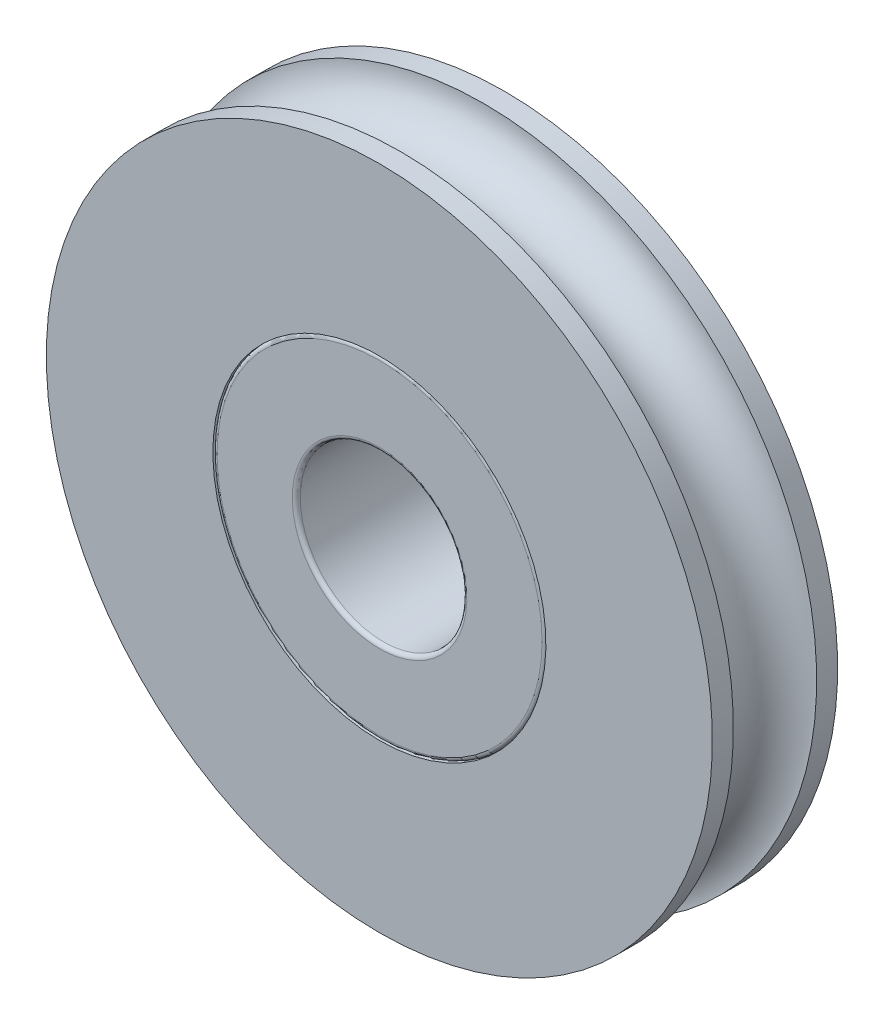
ISO-10303-21;
HEADER;
FILE_DESCRIPTION(('STEP AP214'),'2;1');
FILE_NAME('part.step','',(''),(''),'','','');
FILE_SCHEMA(('AUTOMOTIVE_DESIGN { 1 0 10303 214 1 1 1 1 }'));
ENDSEC;
DATA;
#1=APPLICATION_CONTEXT('core data for automotive mechanical design processes');
#2=APPLICATION_PROTOCOL_DEFINITION('international standard','automotive_design',2000,#1);
#3=PRODUCT_CONTEXT('',#1,'mechanical');
#4=PRODUCT('Part','Part','',(#3));
#5=PRODUCT_RELATED_PRODUCT_CATEGORY('part','',(#4));
#6=PRODUCT_DEFINITION_FORMATION('','',#4);
#7=PRODUCT_DEFINITION_CONTEXT('part definition',#1,'design');
#8=PRODUCT_DEFINITION('design','',#6,#7);
#9=PRODUCT_DEFINITION_SHAPE('','',#8);
#10=(LENGTH_UNIT() NAMED_UNIT(*) SI_UNIT(.MILLI.,.METRE.));
#11=(NAMED_UNIT(*) PLANE_ANGLE_UNIT() SI_UNIT($,.RADIAN.));
#12=(NAMED_UNIT(*) SI_UNIT($,.STERADIAN.) SOLID_ANGLE_UNIT());
#13=UNCERTAINTY_MEASURE_WITH_UNIT(LENGTH_MEASURE(1.E-05),#10,'distance_accuracy_value','');
#14=(GEOMETRIC_REPRESENTATION_CONTEXT(3) GLOBAL_UNCERTAINTY_ASSIGNED_CONTEXT((#13)) GLOBAL_UNIT_ASSIGNED_CONTEXT((#10,
#11,#12)) REPRESENTATION_CONTEXT('',''));
#15=CARTESIAN_POINT('',(0.,0.,0.));
#16=DIRECTION('',(0.,0.,1.));
#17=DIRECTION('',(1.,0.,0.));
#18=AXIS2_PLACEMENT_3D('',#15,#16,#17);
#19=CARTESIAN_POINT('',(0.,6.35,0.));
#20=DIRECTION('',(0.,0.,-1.));
#21=DIRECTION('',(0.,1.,0.));
#22=AXIS2_PLACEMENT_3D('',#19,#20,#21);
#23=PLANE('',#22);
#24=CARTESIAN_POINT('',(0.,0.,0.));
#25=DIRECTION('',(0.,0.,-1.));
#26=DIRECTION('',(0.,1.,0.));
#27=AXIS2_PLACEMENT_3D('',#24,#25,#26);
#28=CIRCLE('',#27,3.3274);
#29=CARTESIAN_POINT('',(0.,3.3274,0.));
#30=VERTEX_POINT('',#29);
#31=EDGE_CURVE('E59',#30,#30,#28,.T.);
#32=ORIENTED_EDGE('',*,*,#31,.T.);
#33=EDGE_LOOP('',(#32));
#34=FACE_BOUND('',#33,.T.);
#35=CARTESIAN_POINT('',(0.,0.,0.));
#36=DIRECTION('',(0.,0.,-1.));
#37=DIRECTION('',(0.,1.,0.));
#38=AXIS2_PLACEMENT_3D('',#35,#36,#37);
#39=CIRCLE('',#38,6.1976);
#40=CARTESIAN_POINT('',(0.,6.1976,0.));
#41=VERTEX_POINT('',#40);
#42=EDGE_CURVE('E62',#41,#41,#39,.F.);
#43=ORIENTED_EDGE('',*,*,#42,.T.);
#44=EDGE_LOOP('',(#43));
#45=FACE_BOUND('',#44,.T.);
#46=ADVANCED_FACE('F39',(#34,#45),#23,.F.);
#47=CARTESIAN_POINT('',(0.,0.,0.));
#48=DIRECTION('',(0.,0.,1.));
#49=DIRECTION('',(0.,-1.,0.));
#50=AXIS2_PLACEMENT_3D('',#47,#48,#49);
#51=CYLINDRICAL_SURFACE('',#50,3.175);
#52=CARTESIAN_POINT('',(0.,0.,-0.152399999999994));
#53=DIRECTION('',(0.,0.,-1.));
#54=DIRECTION('',(0.,1.,0.));
#55=AXIS2_PLACEMENT_3D('',#52,#53,#54);
#56=CIRCLE('',#55,3.175);
#57=CARTESIAN_POINT('',(0.,3.175,-0.152399999999998));
#58=VERTEX_POINT('',#57);
#59=EDGE_CURVE('E65',#58,#58,#56,.F.);
#60=ORIENTED_EDGE('',*,*,#59,.T.);
#61=EDGE_LOOP('',(#60));
#62=FACE_BOUND('',#61,.T.);
#63=CARTESIAN_POINT('',(0.,0.,-4.61009999999999));
#64=DIRECTION('',(0.,0.,1.));
#65=DIRECTION('',(0.,-1.,0.));
#66=AXIS2_PLACEMENT_3D('',#63,#64,#65);
#67=CIRCLE('',#66,3.175);
#68=CARTESIAN_POINT('',(0.,-3.17499999999999,-4.61009999999999));
#69=VERTEX_POINT('',#68);
#70=EDGE_CURVE('E68',#69,#69,#67,.F.);
#71=ORIENTED_EDGE('',*,*,#70,.T.);
#72=EDGE_LOOP('',(#71));
#73=FACE_BOUND('',#72,.T.);
#74=ADVANCED_FACE('F72',(#62,#73),#51,.F.);
#75=CARTESIAN_POINT('',(0.,6.35,-4.7625));
#76=DIRECTION('',(0.,0.,1.));
#77=DIRECTION('',(0.,-1.,0.));
#78=AXIS2_PLACEMENT_3D('',#75,#76,#77);
#79=PLANE('',#78);
#80=CARTESIAN_POINT('',(0.,0.,-4.76249999999999));
#81=DIRECTION('',(0.,0.,1.));
#82=DIRECTION('',(0.,-1.,0.));
#83=AXIS2_PLACEMENT_3D('',#80,#81,#82);
#84=CIRCLE('',#83,3.3274);
#85=CARTESIAN_POINT('',(0.,-3.3274,-4.76249999999999));
#86=VERTEX_POINT('',#85);
#87=EDGE_CURVE('E50',#86,#86,#84,.T.);
#88=ORIENTED_EDGE('',*,*,#87,.T.);
#89=EDGE_LOOP('',(#88));
#90=FACE_BOUND('',#89,.T.);
#91=CARTESIAN_POINT('',(0.,0.,-4.76249999999999));
#92=DIRECTION('',(0.,0.,1.));
#93=DIRECTION('',(0.,-1.,0.));
#94=AXIS2_PLACEMENT_3D('',#91,#92,#93);
#95=CIRCLE('',#94,6.1976);
#96=CARTESIAN_POINT('',(0.,-6.1976,-4.76249999999998));
#97=VERTEX_POINT('',#96);
#98=EDGE_CURVE('E54',#97,#97,#95,.F.);
#99=ORIENTED_EDGE('',*,*,#98,.T.);
#100=EDGE_LOOP('',(#99));
#101=FACE_BOUND('',#100,.T.);
#102=ADVANCED_FACE('F82',(#90,#101),#79,.F.);
#103=CARTESIAN_POINT('',(0.,0.,0.));
#104=DIRECTION('',(0.,0.,1.));
#105=DIRECTION('',(0.,-1.,0.));
#106=AXIS2_PLACEMENT_3D('',#103,#104,#105);
#107=CYLINDRICAL_SURFACE('',#106,6.35);
#108=CARTESIAN_POINT('',(0.,0.,-4.61009999999999));
#109=DIRECTION('',(0.,0.,1.));
#110=DIRECTION('',(0.,-1.,0.));
#111=AXIS2_PLACEMENT_3D('',#108,#109,#110);
#112=CIRCLE('',#111,6.35);
#113=CARTESIAN_POINT('',(0.,-6.34999999999999,-4.61009999999998));
#114=VERTEX_POINT('',#113);
#115=EDGE_CURVE('E11',#114,#114,#112,.T.);
#116=ORIENTED_EDGE('',*,*,#115,.T.);
#117=EDGE_LOOP('',(#116));
#118=FACE_BOUND('',#117,.T.);
#119=CARTESIAN_POINT('',(0.,0.,-0.152399999999994));
#120=DIRECTION('',(0.,0.,-1.));
#121=DIRECTION('',(0.,1.,0.));
#122=AXIS2_PLACEMENT_3D('',#119,#120,#121);
#123=CIRCLE('',#122,6.35);
#124=CARTESIAN_POINT('',(0.,6.35,-0.152400000000002));
#125=VERTEX_POINT('',#124);
#126=EDGE_CURVE('E46',#125,#125,#123,.T.);
#127=ORIENTED_EDGE('',*,*,#126,.T.);
#128=EDGE_LOOP('',(#127));
#129=FACE_BOUND('',#128,.T.);
#130=ADVANCED_FACE('F85',(#118,#129),#107,.T.);
#131=CARTESIAN_POINT('',(0.,0.,-0.152399999999994));
#132=DIRECTION('',(0.,0.,-1.));
#133=DIRECTION('',(0.,1.,0.));
#134=AXIS2_PLACEMENT_3D('',#131,#132,#133);
#135=TOROIDAL_SURFACE('',#134,3.3274,0.1524);
#136=ORIENTED_EDGE('',*,*,#31,.F.);
#137=EDGE_LOOP('',(#136));
#138=FACE_BOUND('',#137,.T.);
#139=ORIENTED_EDGE('',*,*,#59,.F.);
#140=EDGE_LOOP('',(#139));
#141=FACE_BOUND('',#140,.T.);
#142=ADVANCED_FACE('F78',(#138,#141),#135,.T.);
#143=CARTESIAN_POINT('',(0.,0.,-4.61009999999999));
#144=DIRECTION('',(0.,0.,1.));
#145=DIRECTION('',(0.,-1.,0.));
#146=AXIS2_PLACEMENT_3D('',#143,#144,#145);
#147=TOROIDAL_SURFACE('',#146,3.3274,0.1524);
#148=ORIENTED_EDGE('',*,*,#70,.F.);
#149=EDGE_LOOP('',(#148));
#150=FACE_BOUND('',#149,.T.);
#151=ORIENTED_EDGE('',*,*,#87,.F.);
#152=EDGE_LOOP('',(#151));
#153=FACE_BOUND('',#152,.T.);
#154=ADVANCED_FACE('F74',(#150,#153),#147,.T.);
#155=CARTESIAN_POINT('',(0.,0.,-4.61009999999999));
#156=DIRECTION('',(0.,0.,1.));
#157=DIRECTION('',(0.,-1.,0.));
#158=AXIS2_PLACEMENT_3D('',#155,#156,#157);
#159=TOROIDAL_SURFACE('',#158,6.1976,0.1524);
#160=ORIENTED_EDGE('',*,*,#98,.F.);
#161=EDGE_LOOP('',(#160));
#162=FACE_BOUND('',#161,.T.);
#163=ORIENTED_EDGE('',*,*,#115,.F.);
#164=EDGE_LOOP('',(#163));
#165=FACE_BOUND('',#164,.T.);
#166=ADVANCED_FACE('F77',(#162,#165),#159,.T.);
#167=CARTESIAN_POINT('',(0.,0.,-0.152399999999994));
#168=DIRECTION('',(0.,0.,-1.));
#169=DIRECTION('',(0.,1.,0.));
#170=AXIS2_PLACEMENT_3D('',#167,#168,#169);
#171=TOROIDAL_SURFACE('',#170,6.1976,0.1524);
#172=ORIENTED_EDGE('',*,*,#126,.F.);
#173=EDGE_LOOP('',(#172));
#174=FACE_BOUND('',#173,.T.);
#175=ORIENTED_EDGE('',*,*,#42,.F.);
#176=EDGE_LOOP('',(#175));
#177=FACE_BOUND('',#176,.T.);
#178=ADVANCED_FACE('F41',(#174,#177),#171,.T.);
#179=CLOSED_SHELL('',(#46,#74,#102,#130,#142,#154,#166,#178));
#180=MANIFOLD_SOLID_BREP('B2',#179);
#181=CARTESIAN_POINT('',(0.,6.35,-4.76885));
#182=DIRECTION('',(0.,0.,1.));
#183=DIRECTION('',(0.,-1.,0.));
#184=AXIS2_PLACEMENT_3D('',#181,#182,#183);
#185=PLANE('',#184);
#186=CARTESIAN_POINT('',(0.,0.,-4.76885));
#187=DIRECTION('',(0.,0.,1.));
#188=DIRECTION('',(0.,-1.,0.));
#189=AXIS2_PLACEMENT_3D('',#186,#187,#188);
#190=CIRCLE('',#189,12.7);
#191=CARTESIAN_POINT('',(0.,-12.7,-4.76885));
#192=VERTEX_POINT('',#191);
#193=EDGE_CURVE('E38',#192,#192,#190,.T.);
#194=ORIENTED_EDGE('',*,*,#193,.F.);
#195=EDGE_LOOP('',(#194));
#196=FACE_BOUND('',#195,.T.);
#197=CARTESIAN_POINT('',(0.,0.,-4.76885));
#198=DIRECTION('',(0.,0.,1.));
#199=DIRECTION('',(0.,-1.,0.));
#200=AXIS2_PLACEMENT_3D('',#197,#198,#199);
#201=CIRCLE('',#200,6.35);
#202=CARTESIAN_POINT('',(0.,-6.35,-4.76885));
#203=VERTEX_POINT('',#202);
#204=EDGE_CURVE('E183',#203,#203,#201,.T.);
#205=ORIENTED_EDGE('',*,*,#204,.T.);
#206=EDGE_LOOP('',(#205));
#207=FACE_BOUND('',#206,.T.);
#208=ADVANCED_FACE('F161',(#196,#207),#185,.F.);
#209=CARTESIAN_POINT('',(0.,0.,0.));
#210=DIRECTION('',(0.,0.,1.));
#211=DIRECTION('',(0.,-1.,0.));
#212=AXIS2_PLACEMENT_3D('',#209,#210,#211);
#213=CYLINDRICAL_SURFACE('',#212,12.7);
#214=CARTESIAN_POINT('',(0.,0.,-3.96829273414423));
#215=DIRECTION('',(0.,0.,1.));
#216=DIRECTION('',(0.,-1.,0.));
#217=AXIS2_PLACEMENT_3D('',#214,#215,#216);
#218=CIRCLE('',#217,12.7);
#219=CARTESIAN_POINT('',(0.,-12.7,-3.96829273414423));
#220=VERTEX_POINT('',#219);
#221=EDGE_CURVE('E167',#220,#220,#218,.T.);
#222=ORIENTED_EDGE('',*,*,#221,.F.);
#223=EDGE_LOOP('',(#222));
#224=FACE_BOUND('',#223,.T.);
#225=ORIENTED_EDGE('',*,*,#193,.T.);
#226=EDGE_LOOP('',(#225));
#227=FACE_BOUND('',#226,.T.);
#228=ADVANCED_FACE('F208',(#224,#227),#213,.T.);
#229=CARTESIAN_POINT('',(0.,0.,-2.38125));
#230=DIRECTION('',(0.,0.,1.));
#231=DIRECTION('',(0.,-1.,0.));
#232=AXIS2_PLACEMENT_3D('',#229,#230,#231);
#233=TOROIDAL_SURFACE('',#232,12.6619,1.5875);
#234=CARTESIAN_POINT('',(0.,0.,-0.794207265855769));
#235=DIRECTION('',(0.,0.,1.));
#236=DIRECTION('',(0.,-1.,0.));
#237=AXIS2_PLACEMENT_3D('',#234,#235,#236);
#238=CIRCLE('',#237,12.7);
#239=CARTESIAN_POINT('',(0.,-12.7,-0.794207265855771));
#240=VERTEX_POINT('',#239);
#241=EDGE_CURVE('E171',#240,#240,#238,.T.);
#242=ORIENTED_EDGE('',*,*,#241,.F.);
#243=EDGE_LOOP('',(#242));
#244=FACE_BOUND('',#243,.T.);
#245=ORIENTED_EDGE('',*,*,#221,.T.);
#246=EDGE_LOOP('',(#245));
#247=FACE_BOUND('',#246,.T.);
#248=ADVANCED_FACE('F203',(#244,#247),#233,.F.);
#249=CARTESIAN_POINT('',(0.,0.,0.));
#250=DIRECTION('',(0.,0.,1.));
#251=DIRECTION('',(0.,-1.,0.));
#252=AXIS2_PLACEMENT_3D('',#249,#250,#251);
#253=CYLINDRICAL_SURFACE('',#252,12.7);
#254=CARTESIAN_POINT('',(0.,0.,0.00635000000000057));
#255=DIRECTION('',(0.,0.,1.));
#256=DIRECTION('',(0.,-1.,0.));
#257=AXIS2_PLACEMENT_3D('',#254,#255,#256);
#258=CIRCLE('',#257,12.7);
#259=CARTESIAN_POINT('',(0.,-12.7,0.00634999999999902));
#260=VERTEX_POINT('',#259);
#261=EDGE_CURVE('E175',#260,#260,#258,.T.);
#262=ORIENTED_EDGE('',*,*,#261,.F.);
#263=EDGE_LOOP('',(#262));
#264=FACE_BOUND('',#263,.T.);
#265=ORIENTED_EDGE('',*,*,#241,.T.);
#266=EDGE_LOOP('',(#265));
#267=FACE_BOUND('',#266,.T.);
#268=ADVANCED_FACE('F197',(#264,#267),#253,.T.);
#269=CARTESIAN_POINT('',(0.,6.35,0.00635000000000174));
#270=DIRECTION('',(0.,0.,-1.));
#271=DIRECTION('',(0.,1.,0.));
#272=AXIS2_PLACEMENT_3D('',#269,#270,#271);
#273=PLANE('',#272);
#274=CARTESIAN_POINT('',(0.,0.,0.00635000000000136));
#275=DIRECTION('',(0.,0.,1.));
#276=DIRECTION('',(0.,-1.,0.));
#277=AXIS2_PLACEMENT_3D('',#274,#275,#276);
#278=CIRCLE('',#277,6.35);
#279=CARTESIAN_POINT('',(0.,-6.35,0.00635000000000058));
#280=VERTEX_POINT('',#279);
#281=EDGE_CURVE('E180',#280,#280,#278,.T.);
#282=ORIENTED_EDGE('',*,*,#281,.F.);
#283=EDGE_LOOP('',(#282));
#284=FACE_BOUND('',#283,.T.);
#285=ORIENTED_EDGE('',*,*,#261,.T.);
#286=EDGE_LOOP('',(#285));
#287=FACE_BOUND('',#286,.T.);
#288=ADVANCED_FACE('F191',(#284,#287),#273,.F.);
#289=CARTESIAN_POINT('',(0.,0.,0.));
#290=DIRECTION('',(0.,0.,1.));
#291=DIRECTION('',(0.,-1.,0.));
#292=AXIS2_PLACEMENT_3D('',#289,#290,#291);
#293=CYLINDRICAL_SURFACE('',#292,6.35);
#294=ORIENTED_EDGE('',*,*,#204,.F.);
#295=EDGE_LOOP('',(#294));
#296=FACE_BOUND('',#295,.T.);
#297=ORIENTED_EDGE('',*,*,#281,.T.);
#298=EDGE_LOOP('',(#297));
#299=FACE_BOUND('',#298,.T.);
#300=ADVANCED_FACE('F188',(#296,#299),#293,.F.);
#301=CLOSED_SHELL('',(#208,#228,#248,#268,#288,#300));
#302=MANIFOLD_SOLID_BREP('B6',#301);
#303=ADVANCED_BREP_SHAPE_REPRESENTATION('',(#18,#180,#302),#14);
#304=SHAPE_DEFINITION_REPRESENTATION(#9,#303);
ENDSEC;
END-ISO-10303-21;
